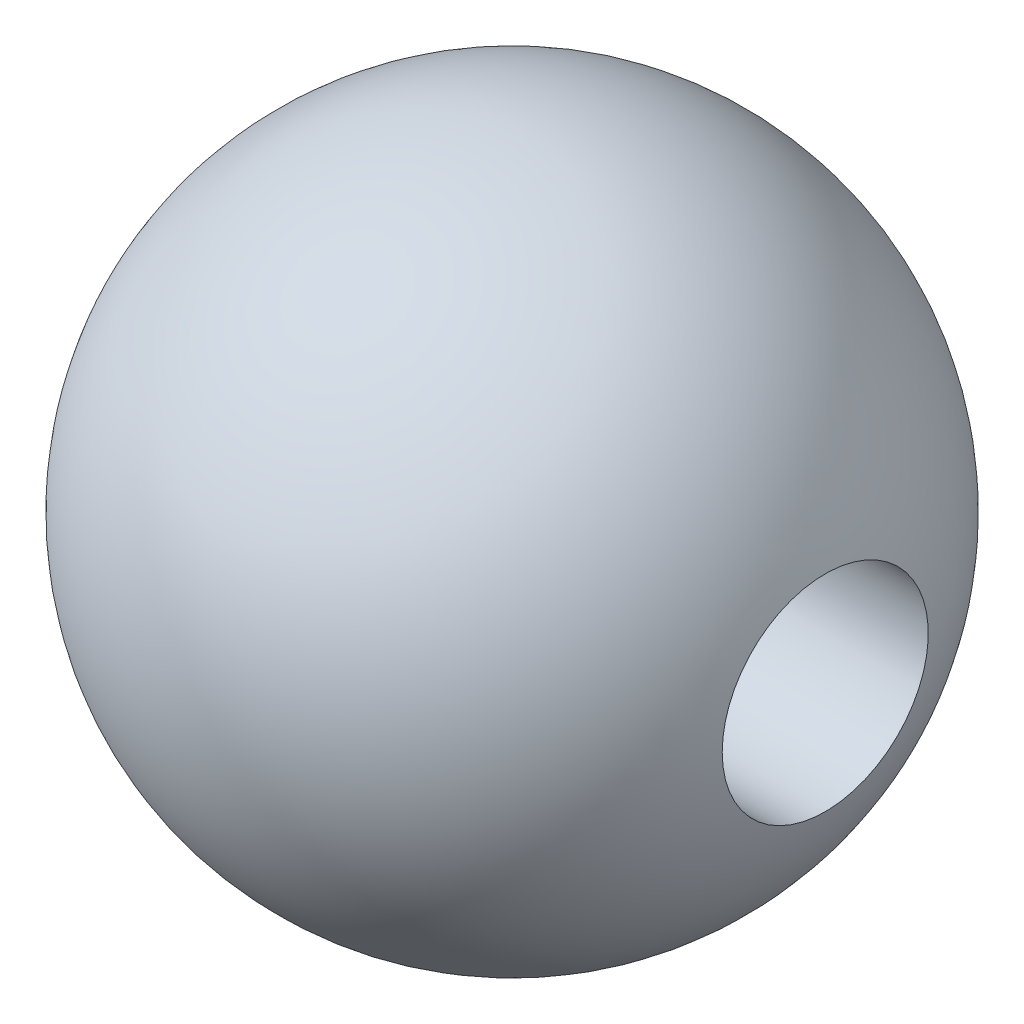
ISO-10303-21;
HEADER;
FILE_DESCRIPTION(('STEP AP214'),'2;1');
FILE_NAME('part.step','',(''),(''),'','','');
FILE_SCHEMA(('AUTOMOTIVE_DESIGN { 1 0 10303 214 1 1 1 1 }'));
ENDSEC;
DATA;
#1=APPLICATION_CONTEXT('core data for automotive mechanical design processes');
#2=APPLICATION_PROTOCOL_DEFINITION('international standard','automotive_design',2000,#1);
#3=PRODUCT_CONTEXT('',#1,'mechanical');
#4=PRODUCT('Part','Part','',(#3));
#5=PRODUCT_RELATED_PRODUCT_CATEGORY('part','',(#4));
#6=PRODUCT_DEFINITION_FORMATION('','',#4);
#7=PRODUCT_DEFINITION_CONTEXT('part definition',#1,'design');
#8=PRODUCT_DEFINITION('design','',#6,#7);
#9=PRODUCT_DEFINITION_SHAPE('','',#8);
#10=(LENGTH_UNIT() NAMED_UNIT(*) SI_UNIT(.MILLI.,.METRE.));
#11=(NAMED_UNIT(*) PLANE_ANGLE_UNIT() SI_UNIT($,.RADIAN.));
#12=(NAMED_UNIT(*) SI_UNIT($,.STERADIAN.) SOLID_ANGLE_UNIT());
#13=UNCERTAINTY_MEASURE_WITH_UNIT(LENGTH_MEASURE(1.E-05),#10,'distance_accuracy_value','');
#14=(GEOMETRIC_REPRESENTATION_CONTEXT(3) GLOBAL_UNCERTAINTY_ASSIGNED_CONTEXT((#13)) GLOBAL_UNIT_ASSIGNED_CONTEXT((#10,
#11,#12)) REPRESENTATION_CONTEXT('',''));
#15=CARTESIAN_POINT('',(0.,0.,0.));
#16=DIRECTION('',(0.,0.,1.));
#17=DIRECTION('',(1.,0.,0.));
#18=AXIS2_PLACEMENT_3D('',#15,#16,#17);
#19=CARTESIAN_POINT('',(0.,0.,0.));
#20=DIRECTION('',(-0.888366206049731,0.,0.459135583405171));
#21=DIRECTION('',(-0.459135583405171,0.,-0.888366206049731));
#22=AXIS2_PLACEMENT_3D('',#19,#20,#21);
#23=SPHERICAL_SURFACE('',#22,8.);
#24=CARTESIAN_POINT('',(0.,0.,0.));
#25=DIRECTION('',(-1.,0.,0.));
#26=DIRECTION('',(0.,0.,1.));
#27=AXIS2_PLACEMENT_3D('',#24,#25,#26);
#28=SPHERICAL_SURFACE('',#27,8.);
#29=CARTESIAN_POINT('',(7.59934207678533,0.,0.));
#30=DIRECTION('',(-1.,0.,0.));
#31=DIRECTION('',(0.,0.,1.));
#32=AXIS2_PLACEMENT_3D('',#29,#30,#31);
#33=CIRCLE('',#32,2.5);
#34=CARTESIAN_POINT('',(7.59934207678533,0.,2.5));
#35=VERTEX_POINT('',#34);
#36=EDGE_CURVE('E10',#35,#35,#33,.F.);
#37=ORIENTED_EDGE('',*,*,#36,.F.);
#38=EDGE_LOOP('',(#37));
#39=FACE_BOUND('',#38,.T.);
#40=CARTESIAN_POINT('',(-7.59934207678533,0.,0.));
#41=DIRECTION('',(1.,0.,0.));
#42=DIRECTION('',(0.,0.,-1.));
#43=AXIS2_PLACEMENT_3D('',#40,#41,#42);
#44=CIRCLE('',#43,2.5);
#45=CARTESIAN_POINT('',(-7.59934207678533,0.,-2.5));
#46=VERTEX_POINT('',#45);
#47=EDGE_CURVE('E46',#46,#46,#44,.F.);
#48=ORIENTED_EDGE('',*,*,#47,.F.);
#49=EDGE_LOOP('',(#48));
#50=FACE_BOUND('',#49,.T.);
#51=ADVANCED_FACE('F39',(#39,#50),#28,.T.);
#52=CARTESIAN_POINT('',(-12.,0.,0.));
#53=DIRECTION('',(1.,0.,0.));
#54=DIRECTION('',(0.,0.,-1.));
#55=AXIS2_PLACEMENT_3D('',#52,#53,#54);
#56=CYLINDRICAL_SURFACE('',#55,2.5);
#57=ORIENTED_EDGE('',*,*,#36,.T.);
#58=EDGE_LOOP('',(#57));
#59=FACE_BOUND('',#58,.T.);
#60=ORIENTED_EDGE('',*,*,#47,.T.);
#61=EDGE_LOOP('',(#60));
#62=FACE_BOUND('',#61,.T.);
#63=ADVANCED_FACE('F53',(#59,#62),#56,.F.);
#64=CLOSED_SHELL('',(#51,#63));
#65=MANIFOLD_SOLID_BREP('B2',#64);
#66=ADVANCED_BREP_SHAPE_REPRESENTATION('',(#18,#65),#14);
#67=SHAPE_DEFINITION_REPRESENTATION(#9,#66);
ENDSEC;
END-ISO-10303-21;
